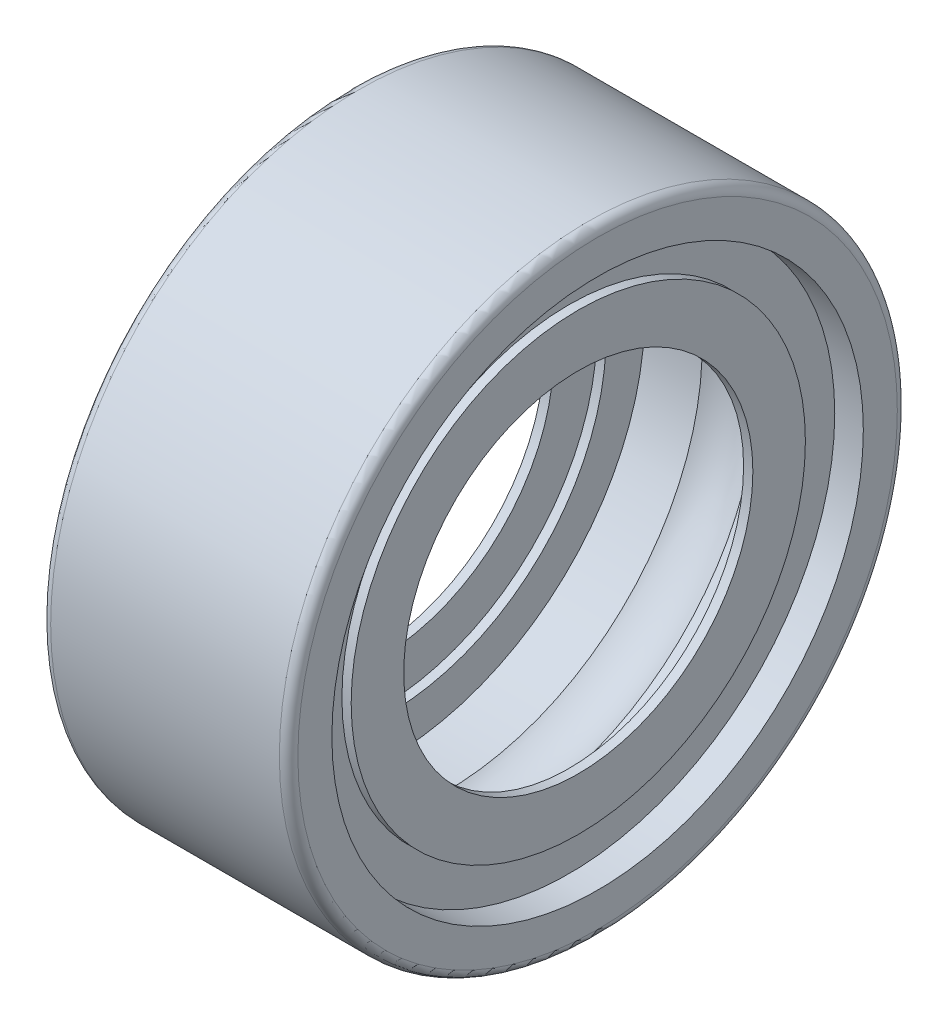
ISO-10303-21;
HEADER;
FILE_DESCRIPTION(('STEP AP214'),'2;1');
FILE_NAME('part.step','',(''),(''),'','','');
FILE_SCHEMA(('AUTOMOTIVE_DESIGN { 1 0 10303 214 1 1 1 1 }'));
ENDSEC;
DATA;
#1=APPLICATION_CONTEXT('core data for automotive mechanical design processes');
#2=APPLICATION_PROTOCOL_DEFINITION('international standard','automotive_design',2000,#1);
#3=PRODUCT_CONTEXT('',#1,'mechanical');
#4=PRODUCT('Part','Part','',(#3));
#5=PRODUCT_RELATED_PRODUCT_CATEGORY('part','',(#4));
#6=PRODUCT_DEFINITION_FORMATION('','',#4);
#7=PRODUCT_DEFINITION_CONTEXT('part definition',#1,'design');
#8=PRODUCT_DEFINITION('design','',#6,#7);
#9=PRODUCT_DEFINITION_SHAPE('','',#8);
#10=(LENGTH_UNIT() NAMED_UNIT(*) SI_UNIT(.MILLI.,.METRE.));
#11=(NAMED_UNIT(*) PLANE_ANGLE_UNIT() SI_UNIT($,.RADIAN.));
#12=(NAMED_UNIT(*) SI_UNIT($,.STERADIAN.) SOLID_ANGLE_UNIT());
#13=UNCERTAINTY_MEASURE_WITH_UNIT(LENGTH_MEASURE(1.E-05),#10,'distance_accuracy_value','');
#14=(GEOMETRIC_REPRESENTATION_CONTEXT(3) GLOBAL_UNCERTAINTY_ASSIGNED_CONTEXT((#13)) GLOBAL_UNIT_ASSIGNED_CONTEXT((#10,
#11,#12)) REPRESENTATION_CONTEXT('',''));
#15=CARTESIAN_POINT('',(0.,0.,0.));
#16=DIRECTION('',(0.,0.,1.));
#17=DIRECTION('',(1.,0.,0.));
#18=AXIS2_PLACEMENT_3D('',#15,#16,#17);
#19=CARTESIAN_POINT('',(0.899999999999999,0.,0.));
#20=DIRECTION('',(1.,0.,0.));
#21=DIRECTION('',(0.,0.,1.));
#22=AXIS2_PLACEMENT_3D('',#19,#20,#21);
#23=TOROIDAL_SURFACE('',#22,3.525,0.774999999999996);
#24=CARTESIAN_POINT('',(0.441742430504414,0.,0.));
#25=DIRECTION('',(-1.,0.,0.));
#26=DIRECTION('',(0.,0.,1.));
#27=AXIS2_PLACEMENT_3D('',#24,#25,#26);
#28=CIRCLE('',#27,4.15);
#29=CARTESIAN_POINT('',(0.441742430504414,0.,4.15));
#30=VERTEX_POINT('',#29);
#31=EDGE_CURVE('E445',#30,#30,#28,.T.);
#32=ORIENTED_EDGE('',*,*,#31,.T.);
#33=EDGE_LOOP('',(#32));
#34=FACE_BOUND('',#33,.T.);
#35=CARTESIAN_POINT('',(1.35825756949558,0.,0.));
#36=DIRECTION('',(-1.,0.,0.));
#37=DIRECTION('',(0.,0.,1.));
#38=AXIS2_PLACEMENT_3D('',#35,#36,#37);
#39=CIRCLE('',#38,4.15);
#40=CARTESIAN_POINT('',(1.35825756949558,0.,4.15));
#41=VERTEX_POINT('',#40);
#42=EDGE_CURVE('E448',#41,#41,#39,.F.);
#43=ORIENTED_EDGE('',*,*,#42,.T.);
#44=EDGE_LOOP('',(#43));
#45=FACE_BOUND('',#44,.T.);
#46=ADVANCED_FACE('F16',(#34,#45),#23,.F.);
#47=CARTESIAN_POINT('',(-0.0228787847477936,0.,0.));
#48=DIRECTION('',(-1.,0.,0.));
#49=DIRECTION('',(0.,0.,1.));
#50=AXIS2_PLACEMENT_3D('',#47,#48,#49);
#51=CYLINDRICAL_SURFACE('',#50,4.15);
#52=CARTESIAN_POINT('',(-0.487500000000001,0.,0.));
#53=DIRECTION('',(-1.,0.,0.));
#54=DIRECTION('',(0.,0.,1.));
#55=AXIS2_PLACEMENT_3D('',#52,#53,#54);
#56=CIRCLE('',#55,4.15);
#57=CARTESIAN_POINT('',(-0.487500000000001,0.,4.15));
#58=VERTEX_POINT('',#57);
#59=EDGE_CURVE('E449',#58,#58,#56,.F.);
#60=ORIENTED_EDGE('',*,*,#59,.F.);
#61=EDGE_LOOP('',(#60));
#62=FACE_BOUND('',#61,.T.);
#63=ORIENTED_EDGE('',*,*,#31,.F.);
#64=EDGE_LOOP('',(#63));
#65=FACE_BOUND('',#64,.T.);
#66=ADVANCED_FACE('F367',(#62,#65),#51,.F.);
#67=CARTESIAN_POINT('',(1.82287878474779,0.,0.));
#68=DIRECTION('',(-1.,0.,0.));
#69=DIRECTION('',(0.,0.,1.));
#70=AXIS2_PLACEMENT_3D('',#67,#68,#69);
#71=CYLINDRICAL_SURFACE('',#70,4.15);
#72=ORIENTED_EDGE('',*,*,#42,.F.);
#73=EDGE_LOOP('',(#72));
#74=FACE_BOUND('',#73,.T.);
#75=CARTESIAN_POINT('',(2.2875,0.,0.));
#76=DIRECTION('',(-1.,0.,0.));
#77=DIRECTION('',(0.,0.,1.));
#78=AXIS2_PLACEMENT_3D('',#75,#76,#77);
#79=CIRCLE('',#78,4.15);
#80=CARTESIAN_POINT('',(2.2875,0.,4.15));
#81=VERTEX_POINT('',#80);
#82=EDGE_CURVE('E452',#81,#81,#79,.T.);
#83=ORIENTED_EDGE('',*,*,#82,.F.);
#84=EDGE_LOOP('',(#83));
#85=FACE_BOUND('',#84,.T.);
#86=ADVANCED_FACE('F356',(#74,#85),#71,.F.);
#87=CARTESIAN_POINT('',(-0.487500000000001,0.,3.9125));
#88=DIRECTION('',(1.,0.,0.));
#89=DIRECTION('',(0.,0.,-1.));
#90=AXIS2_PLACEMENT_3D('',#87,#88,#89);
#91=PLANE('',#90);
#92=ORIENTED_EDGE('',*,*,#59,.T.);
#93=EDGE_LOOP('',(#92));
#94=FACE_BOUND('',#93,.T.);
#95=CARTESIAN_POINT('',(-0.487500000000001,0.,0.));
#96=DIRECTION('',(-1.,0.,0.));
#97=DIRECTION('',(0.,0.,1.));
#98=AXIS2_PLACEMENT_3D('',#95,#96,#97);
#99=CIRCLE('',#98,3.525);
#100=CARTESIAN_POINT('',(-0.487500000000001,0.,3.525));
#101=VERTEX_POINT('',#100);
#102=EDGE_CURVE('E499',#101,#101,#99,.T.);
#103=ORIENTED_EDGE('',*,*,#102,.T.);
#104=EDGE_LOOP('',(#103));
#105=FACE_BOUND('',#104,.T.);
#106=ADVANCED_FACE('F345',(#94,#105),#91,.T.);
#107=CARTESIAN_POINT('',(2.2875,0.,3.9125));
#108=DIRECTION('',(-1.,0.,0.));
#109=DIRECTION('',(0.,0.,1.));
#110=AXIS2_PLACEMENT_3D('',#107,#108,#109);
#111=PLANE('',#110);
#112=ORIENTED_EDGE('',*,*,#82,.T.);
#113=EDGE_LOOP('',(#112));
#114=FACE_BOUND('',#113,.T.);
#115=CARTESIAN_POINT('',(2.2875,0.,0.));
#116=DIRECTION('',(1.,0.,0.));
#117=DIRECTION('',(0.,0.,-1.));
#118=AXIS2_PLACEMENT_3D('',#115,#116,#117);
#119=CIRCLE('',#118,3.525);
#120=CARTESIAN_POINT('',(2.2875,0.,-3.525));
#121=VERTEX_POINT('',#120);
#122=EDGE_CURVE('E496',#121,#121,#119,.T.);
#123=ORIENTED_EDGE('',*,*,#122,.T.);
#124=EDGE_LOOP('',(#123));
#125=FACE_BOUND('',#124,.T.);
#126=ADVANCED_FACE('F334',(#114,#125),#111,.T.);
#127=CARTESIAN_POINT('',(-0.562500000000001,0.,0.));
#128=DIRECTION('',(-1.,0.,0.));
#129=DIRECTION('',(0.,0.,1.));
#130=AXIS2_PLACEMENT_3D('',#127,#128,#129);
#131=CYLINDRICAL_SURFACE('',#130,3.525);
#132=CARTESIAN_POINT('',(-0.637500000000001,0.,0.));
#133=DIRECTION('',(-1.,0.,0.));
#134=DIRECTION('',(0.,0.,1.));
#135=AXIS2_PLACEMENT_3D('',#132,#133,#134);
#136=CIRCLE('',#135,3.525);
#137=CARTESIAN_POINT('',(-0.637500000000001,0.,3.525));
#138=VERTEX_POINT('',#137);
#139=EDGE_CURVE('E493',#138,#138,#136,.F.);
#140=ORIENTED_EDGE('',*,*,#139,.F.);
#141=EDGE_LOOP('',(#140));
#142=FACE_BOUND('',#141,.T.);
#143=ORIENTED_EDGE('',*,*,#102,.F.);
#144=EDGE_LOOP('',(#143));
#145=FACE_BOUND('',#144,.T.);
#146=ADVANCED_FACE('F323',(#142,#145),#131,.F.);
#147=CARTESIAN_POINT('',(2.3625,0.,0.));
#148=DIRECTION('',(1.,0.,0.));
#149=DIRECTION('',(0.,0.,-1.));
#150=AXIS2_PLACEMENT_3D('',#147,#148,#149);
#151=CYLINDRICAL_SURFACE('',#150,3.525);
#152=CARTESIAN_POINT('',(2.4375,0.,0.));
#153=DIRECTION('',(1.,0.,0.));
#154=DIRECTION('',(0.,0.,-1.));
#155=AXIS2_PLACEMENT_3D('',#152,#153,#154);
#156=CIRCLE('',#155,3.525);
#157=CARTESIAN_POINT('',(2.4375,0.,-3.525));
#158=VERTEX_POINT('',#157);
#159=EDGE_CURVE('E490',#158,#158,#156,.F.);
#160=ORIENTED_EDGE('',*,*,#159,.F.);
#161=EDGE_LOOP('',(#160));
#162=FACE_BOUND('',#161,.T.);
#163=ORIENTED_EDGE('',*,*,#122,.F.);
#164=EDGE_LOOP('',(#163));
#165=FACE_BOUND('',#164,.T.);
#166=ADVANCED_FACE('F312',(#162,#165),#151,.F.);
#167=CARTESIAN_POINT('',(-0.637500000000001,0.,3.175));
#168=DIRECTION('',(1.,0.,0.));
#169=DIRECTION('',(0.,0.,-1.));
#170=AXIS2_PLACEMENT_3D('',#167,#168,#169);
#171=PLANE('',#170);
#172=ORIENTED_EDGE('',*,*,#139,.T.);
#173=EDGE_LOOP('',(#172));
#174=FACE_BOUND('',#173,.T.);
#175=CARTESIAN_POINT('',(-0.637500000000001,0.,0.));
#176=DIRECTION('',(-1.,0.,0.));
#177=DIRECTION('',(0.,0.,1.));
#178=AXIS2_PLACEMENT_3D('',#175,#176,#177);
#179=CIRCLE('',#178,2.825);
#180=CARTESIAN_POINT('',(-0.637500000000001,0.,2.825));
#181=VERTEX_POINT('',#180);
#182=EDGE_CURVE('E487',#181,#181,#179,.T.);
#183=ORIENTED_EDGE('',*,*,#182,.T.);
#184=EDGE_LOOP('',(#183));
#185=FACE_BOUND('',#184,.T.);
#186=ADVANCED_FACE('F301',(#174,#185),#171,.T.);
#187=CARTESIAN_POINT('',(2.4375,0.,3.175));
#188=DIRECTION('',(-1.,0.,0.));
#189=DIRECTION('',(0.,0.,1.));
#190=AXIS2_PLACEMENT_3D('',#187,#188,#189);
#191=PLANE('',#190);
#192=ORIENTED_EDGE('',*,*,#159,.T.);
#193=EDGE_LOOP('',(#192));
#194=FACE_BOUND('',#193,.T.);
#195=CARTESIAN_POINT('',(2.4375,0.,0.));
#196=DIRECTION('',(1.,0.,0.));
#197=DIRECTION('',(0.,0.,-1.));
#198=AXIS2_PLACEMENT_3D('',#195,#196,#197);
#199=CIRCLE('',#198,2.825);
#200=CARTESIAN_POINT('',(2.4375,0.,-2.825));
#201=VERTEX_POINT('',#200);
#202=EDGE_CURVE('E484',#201,#201,#199,.T.);
#203=ORIENTED_EDGE('',*,*,#202,.T.);
#204=EDGE_LOOP('',(#203));
#205=FACE_BOUND('',#204,.T.);
#206=ADVANCED_FACE('F290',(#194,#205),#191,.T.);
#207=CARTESIAN_POINT('',(-0.712500000000001,0.,0.));
#208=DIRECTION('',(-1.,0.,0.));
#209=DIRECTION('',(0.,0.,1.));
#210=AXIS2_PLACEMENT_3D('',#207,#208,#209);
#211=CYLINDRICAL_SURFACE('',#210,2.825);
#212=CARTESIAN_POINT('',(-0.787500000000001,0.,0.));
#213=DIRECTION('',(-1.,0.,0.));
#214=DIRECTION('',(0.,0.,1.));
#215=AXIS2_PLACEMENT_3D('',#212,#213,#214);
#216=CIRCLE('',#215,2.825);
#217=CARTESIAN_POINT('',(-0.787500000000001,0.,2.825));
#218=VERTEX_POINT('',#217);
#219=EDGE_CURVE('E481',#218,#218,#216,.F.);
#220=ORIENTED_EDGE('',*,*,#219,.F.);
#221=EDGE_LOOP('',(#220));
#222=FACE_BOUND('',#221,.T.);
#223=ORIENTED_EDGE('',*,*,#182,.F.);
#224=EDGE_LOOP('',(#223));
#225=FACE_BOUND('',#224,.T.);
#226=ADVANCED_FACE('F279',(#222,#225),#211,.F.);
#227=CARTESIAN_POINT('',(2.5125,0.,0.));
#228=DIRECTION('',(1.,0.,0.));
#229=DIRECTION('',(0.,0.,-1.));
#230=AXIS2_PLACEMENT_3D('',#227,#228,#229);
#231=CYLINDRICAL_SURFACE('',#230,2.825);
#232=CARTESIAN_POINT('',(2.5875,0.,0.));
#233=DIRECTION('',(1.,0.,0.));
#234=DIRECTION('',(0.,0.,-1.));
#235=AXIS2_PLACEMENT_3D('',#232,#233,#234);
#236=CIRCLE('',#235,2.825);
#237=CARTESIAN_POINT('',(2.5875,0.,-2.825));
#238=VERTEX_POINT('',#237);
#239=EDGE_CURVE('E478',#238,#238,#236,.F.);
#240=ORIENTED_EDGE('',*,*,#239,.F.);
#241=EDGE_LOOP('',(#240));
#242=FACE_BOUND('',#241,.T.);
#243=ORIENTED_EDGE('',*,*,#202,.F.);
#244=EDGE_LOOP('',(#243));
#245=FACE_BOUND('',#244,.T.);
#246=ADVANCED_FACE('F268',(#242,#245),#231,.F.);
#247=CARTESIAN_POINT('',(-0.787500000000001,0.,3.25));
#248=DIRECTION('',(-1.,0.,0.));
#249=DIRECTION('',(0.,0.,1.));
#250=AXIS2_PLACEMENT_3D('',#247,#248,#249);
#251=PLANE('',#250);
#252=ORIENTED_EDGE('',*,*,#219,.T.);
#253=EDGE_LOOP('',(#252));
#254=FACE_BOUND('',#253,.T.);
#255=CARTESIAN_POINT('',(-0.787500000000001,0.,0.));
#256=DIRECTION('',(-1.,0.,0.));
#257=DIRECTION('',(0.,0.,1.));
#258=AXIS2_PLACEMENT_3D('',#255,#256,#257);
#259=CIRCLE('',#258,3.675);
#260=CARTESIAN_POINT('',(-0.787500000000001,0.,3.675));
#261=VERTEX_POINT('',#260);
#262=EDGE_CURVE('E475',#261,#261,#259,.F.);
#263=ORIENTED_EDGE('',*,*,#262,.F.);
#264=EDGE_LOOP('',(#263));
#265=FACE_BOUND('',#264,.T.);
#266=ADVANCED_FACE('F257',(#254,#265),#251,.T.);
#267=CARTESIAN_POINT('',(2.5875,0.,3.25));
#268=DIRECTION('',(1.,0.,0.));
#269=DIRECTION('',(0.,0.,-1.));
#270=AXIS2_PLACEMENT_3D('',#267,#268,#269);
#271=PLANE('',#270);
#272=ORIENTED_EDGE('',*,*,#239,.T.);
#273=EDGE_LOOP('',(#272));
#274=FACE_BOUND('',#273,.T.);
#275=CARTESIAN_POINT('',(2.5875,0.,0.));
#276=DIRECTION('',(1.,0.,0.));
#277=DIRECTION('',(0.,0.,-1.));
#278=AXIS2_PLACEMENT_3D('',#275,#276,#277);
#279=CIRCLE('',#278,3.675);
#280=CARTESIAN_POINT('',(2.5875,0.,-3.675));
#281=VERTEX_POINT('',#280);
#282=EDGE_CURVE('E472',#281,#281,#279,.F.);
#283=ORIENTED_EDGE('',*,*,#282,.F.);
#284=EDGE_LOOP('',(#283));
#285=FACE_BOUND('',#284,.T.);
#286=ADVANCED_FACE('F246',(#274,#285),#271,.T.);
#287=CARTESIAN_POINT('',(-0.712500000000001,0.,0.));
#288=DIRECTION('',(-1.,0.,0.));
#289=DIRECTION('',(0.,0.,1.));
#290=AXIS2_PLACEMENT_3D('',#287,#288,#289);
#291=CYLINDRICAL_SURFACE('',#290,3.675);
#292=CARTESIAN_POINT('',(-0.637500000000001,0.,0.));
#293=DIRECTION('',(-1.,0.,0.));
#294=DIRECTION('',(0.,0.,1.));
#295=AXIS2_PLACEMENT_3D('',#292,#293,#294);
#296=CIRCLE('',#295,3.675);
#297=CARTESIAN_POINT('',(-0.637500000000001,0.,3.675));
#298=VERTEX_POINT('',#297);
#299=EDGE_CURVE('E469',#298,#298,#296,.F.);
#300=ORIENTED_EDGE('',*,*,#299,.F.);
#301=EDGE_LOOP('',(#300));
#302=FACE_BOUND('',#301,.T.);
#303=ORIENTED_EDGE('',*,*,#262,.T.);
#304=EDGE_LOOP('',(#303));
#305=FACE_BOUND('',#304,.T.);
#306=ADVANCED_FACE('F235',(#302,#305),#291,.T.);
#307=CARTESIAN_POINT('',(2.5125,0.,0.));
#308=DIRECTION('',(1.,0.,0.));
#309=DIRECTION('',(0.,0.,-1.));
#310=AXIS2_PLACEMENT_3D('',#307,#308,#309);
#311=CYLINDRICAL_SURFACE('',#310,3.675);
#312=CARTESIAN_POINT('',(2.4375,0.,0.));
#313=DIRECTION('',(1.,0.,0.));
#314=DIRECTION('',(0.,0.,-1.));
#315=AXIS2_PLACEMENT_3D('',#312,#313,#314);
#316=CIRCLE('',#315,3.675);
#317=CARTESIAN_POINT('',(2.4375,0.,-3.675));
#318=VERTEX_POINT('',#317);
#319=EDGE_CURVE('E466',#318,#318,#316,.F.);
#320=ORIENTED_EDGE('',*,*,#319,.F.);
#321=EDGE_LOOP('',(#320));
#322=FACE_BOUND('',#321,.T.);
#323=ORIENTED_EDGE('',*,*,#282,.T.);
#324=EDGE_LOOP('',(#323));
#325=FACE_BOUND('',#324,.T.);
#326=ADVANCED_FACE('F224',(#322,#325),#311,.T.);
#327=CARTESIAN_POINT('',(-0.637500000000001,0.,3.9875));
#328=DIRECTION('',(-1.,0.,0.));
#329=DIRECTION('',(0.,0.,1.));
#330=AXIS2_PLACEMENT_3D('',#327,#328,#329);
#331=PLANE('',#330);
#332=ORIENTED_EDGE('',*,*,#299,.T.);
#333=EDGE_LOOP('',(#332));
#334=FACE_BOUND('',#333,.T.);
#335=CARTESIAN_POINT('',(-0.637500000000001,0.,0.));
#336=DIRECTION('',(-1.,0.,0.));
#337=DIRECTION('',(0.,0.,1.));
#338=AXIS2_PLACEMENT_3D('',#335,#336,#337);
#339=CIRCLE('',#338,4.3);
#340=CARTESIAN_POINT('',(-0.637500000000001,0.,4.3));
#341=VERTEX_POINT('',#340);
#342=EDGE_CURVE('E463',#341,#341,#339,.T.);
#343=ORIENTED_EDGE('',*,*,#342,.T.);
#344=EDGE_LOOP('',(#343));
#345=FACE_BOUND('',#344,.T.);
#346=ADVANCED_FACE('F213',(#334,#345),#331,.T.);
#347=CARTESIAN_POINT('',(2.4375,0.,3.9875));
#348=DIRECTION('',(1.,0.,0.));
#349=DIRECTION('',(0.,0.,-1.));
#350=AXIS2_PLACEMENT_3D('',#347,#348,#349);
#351=PLANE('',#350);
#352=ORIENTED_EDGE('',*,*,#319,.T.);
#353=EDGE_LOOP('',(#352));
#354=FACE_BOUND('',#353,.T.);
#355=CARTESIAN_POINT('',(2.4375,0.,0.));
#356=DIRECTION('',(-1.,0.,0.));
#357=DIRECTION('',(0.,0.,1.));
#358=AXIS2_PLACEMENT_3D('',#355,#356,#357);
#359=CIRCLE('',#358,4.3);
#360=CARTESIAN_POINT('',(2.4375,0.,4.3));
#361=VERTEX_POINT('',#360);
#362=EDGE_CURVE('E460',#361,#361,#359,.F.);
#363=ORIENTED_EDGE('',*,*,#362,.T.);
#364=EDGE_LOOP('',(#363));
#365=FACE_BOUND('',#364,.T.);
#366=ADVANCED_FACE('F203',(#354,#365),#351,.T.);
#367=CARTESIAN_POINT('',(-0.793750000000001,0.,0.));
#368=DIRECTION('',(-1.,0.,0.));
#369=DIRECTION('',(0.,0.,1.));
#370=AXIS2_PLACEMENT_3D('',#367,#368,#369);
#371=CYLINDRICAL_SURFACE('',#370,4.3);
#372=CARTESIAN_POINT('',(-1.1,0.,0.));
#373=DIRECTION('',(-1.,0.,0.));
#374=DIRECTION('',(0.,0.,1.));
#375=AXIS2_PLACEMENT_3D('',#372,#373,#374);
#376=CIRCLE('',#375,4.3);
#377=CARTESIAN_POINT('',(-1.1,0.,4.3));
#378=VERTEX_POINT('',#377);
#379=EDGE_CURVE('E54',#378,#378,#376,.F.);
#380=ORIENTED_EDGE('',*,*,#379,.F.);
#381=EDGE_LOOP('',(#380));
#382=FACE_BOUND('',#381,.T.);
#383=ORIENTED_EDGE('',*,*,#342,.F.);
#384=EDGE_LOOP('',(#383));
#385=FACE_BOUND('',#384,.T.);
#386=ADVANCED_FACE('F193',(#382,#385),#371,.F.);
#387=CARTESIAN_POINT('',(2.59375,0.,0.));
#388=DIRECTION('',(-1.,0.,0.));
#389=DIRECTION('',(0.,0.,1.));
#390=AXIS2_PLACEMENT_3D('',#387,#388,#389);
#391=CYLINDRICAL_SURFACE('',#390,4.3);
#392=ORIENTED_EDGE('',*,*,#362,.F.);
#393=EDGE_LOOP('',(#392));
#394=FACE_BOUND('',#393,.T.);
#395=CARTESIAN_POINT('',(2.9,0.,0.));
#396=DIRECTION('',(-1.,0.,0.));
#397=DIRECTION('',(0.,0.,1.));
#398=AXIS2_PLACEMENT_3D('',#395,#396,#397);
#399=CIRCLE('',#398,4.3);
#400=CARTESIAN_POINT('',(2.9,0.,4.3));
#401=VERTEX_POINT('',#400);
#402=EDGE_CURVE('E53',#401,#401,#399,.T.);
#403=ORIENTED_EDGE('',*,*,#402,.F.);
#404=EDGE_LOOP('',(#403));
#405=FACE_BOUND('',#404,.T.);
#406=ADVANCED_FACE('F79',(#394,#405),#391,.F.);
#407=CARTESIAN_POINT('',(-1.1,0.,-4.575));
#408=DIRECTION('',(-1.,0.,0.));
#409=DIRECTION('',(0.,0.,1.));
#410=AXIS2_PLACEMENT_3D('',#407,#408,#409);
#411=PLANE('',#410);
#412=ORIENTED_EDGE('',*,*,#379,.T.);
#413=EDGE_LOOP('',(#412));
#414=FACE_BOUND('',#413,.T.);
#415=CARTESIAN_POINT('',(-1.1,0.,0.));
#416=DIRECTION('',(1.,0.,0.));
#417=DIRECTION('',(0.,0.,-1.));
#418=AXIS2_PLACEMENT_3D('',#415,#416,#417);
#419=CIRCLE('',#418,4.85);
#420=CARTESIAN_POINT('',(-1.1,0.,-4.85));
#421=VERTEX_POINT('',#420);
#422=CARTESIAN_POINT('',(-1.09999999999999,0.,4.85));
#423=VERTEX_POINT('',#422);
#424=EDGE_CURVE('E49',#421,#423,#419,.T.);
#425=ORIENTED_EDGE('',*,*,#424,.F.);
#426=CARTESIAN_POINT('',(-1.1,0.,0.));
#427=DIRECTION('',(1.,0.,0.));
#428=DIRECTION('',(0.,0.,1.));
#429=AXIS2_PLACEMENT_3D('',#426,#427,#428);
#430=CIRCLE('',#429,4.85);
#431=EDGE_CURVE('E45',#423,#421,#430,.T.);
#432=ORIENTED_EDGE('',*,*,#431,.F.);
#433=EDGE_LOOP('',(#425,#432));
#434=FACE_BOUND('',#433,.T.);
#435=ADVANCED_FACE('F58',(#414,#434),#411,.T.);
#436=CARTESIAN_POINT('',(2.9,0.,-4.575));
#437=DIRECTION('',(1.,0.,0.));
#438=DIRECTION('',(0.,0.,-1.));
#439=AXIS2_PLACEMENT_3D('',#436,#437,#438);
#440=PLANE('',#439);
#441=CARTESIAN_POINT('',(2.9,0.,0.));
#442=DIRECTION('',(-1.,0.,0.));
#443=DIRECTION('',(0.,0.,1.));
#444=AXIS2_PLACEMENT_3D('',#441,#442,#443);
#445=CIRCLE('',#444,4.85);
#446=CARTESIAN_POINT('',(2.9,0.,4.85));
#447=VERTEX_POINT('',#446);
#448=CARTESIAN_POINT('',(2.9,0.,-4.85));
#449=VERTEX_POINT('',#448);
#450=EDGE_CURVE('E59',#447,#449,#445,.T.);
#451=ORIENTED_EDGE('',*,*,#450,.F.);
#452=CARTESIAN_POINT('',(2.9,0.,0.));
#453=DIRECTION('',(-1.,0.,0.));
#454=DIRECTION('',(0.,0.,-1.));
#455=AXIS2_PLACEMENT_3D('',#452,#453,#454);
#456=CIRCLE('',#455,4.85);
#457=EDGE_CURVE('E34',#447,#449,#456,.F.);
#458=ORIENTED_EDGE('',*,*,#457,.T.);
#459=EDGE_LOOP('',(#451,#458));
#460=FACE_BOUND('',#459,.T.);
#461=ORIENTED_EDGE('',*,*,#402,.T.);
#462=EDGE_LOOP('',(#461));
#463=FACE_BOUND('',#462,.T.);
#464=ADVANCED_FACE('F78',(#460,#463),#440,.T.);
#465=CARTESIAN_POINT('',(-0.950000000000002,0.,0.));
#466=DIRECTION('',(1.,0.,0.));
#467=DIRECTION('',(0.,0.,1.));
#468=AXIS2_PLACEMENT_3D('',#465,#466,#467);
#469=TOROIDAL_SURFACE('',#468,4.85,0.150000000000001);
#470=CARTESIAN_POINT('',(-0.950000000000002,0.,0.));
#471=DIRECTION('',(-1.,0.,0.));
#472=DIRECTION('',(0.,0.,1.));
#473=AXIS2_PLACEMENT_3D('',#470,#471,#472);
#474=CIRCLE('',#473,5.);
#475=CARTESIAN_POINT('',(-0.950000000000002,0.,5.));
#476=VERTEX_POINT('',#475);
#477=EDGE_CURVE('E28',#476,#476,#474,.F.);
#478=ORIENTED_EDGE('',*,*,#477,.F.);
#479=EDGE_LOOP('',(#478));
#480=FACE_BOUND('',#479,.T.);
#481=ORIENTED_EDGE('',*,*,#424,.T.);
#482=ORIENTED_EDGE('',*,*,#431,.T.);
#483=EDGE_LOOP('',(#481,#482));
#484=FACE_BOUND('',#483,.T.);
#485=ADVANCED_FACE('F48',(#480,#484),#469,.T.);
#486=CARTESIAN_POINT('',(2.75,0.,0.));
#487=DIRECTION('',(1.,0.,0.));
#488=DIRECTION('',(0.,0.,1.));
#489=AXIS2_PLACEMENT_3D('',#486,#487,#488);
#490=TOROIDAL_SURFACE('',#489,4.85,0.150000000000001);
#491=CARTESIAN_POINT('',(2.75,0.,0.));
#492=DIRECTION('',(-1.,0.,0.));
#493=DIRECTION('',(0.,0.,1.));
#494=AXIS2_PLACEMENT_3D('',#491,#492,#493);
#495=CIRCLE('',#494,5.);
#496=CARTESIAN_POINT('',(2.75,0.,5.));
#497=VERTEX_POINT('',#496);
#498=EDGE_CURVE('E11',#497,#497,#495,.T.);
#499=ORIENTED_EDGE('',*,*,#498,.F.);
#500=EDGE_LOOP('',(#499));
#501=FACE_BOUND('',#500,.T.);
#502=ORIENTED_EDGE('',*,*,#450,.T.);
#503=ORIENTED_EDGE('',*,*,#457,.F.);
#504=EDGE_LOOP('',(#502,#503));
#505=FACE_BOUND('',#504,.T.);
#506=ADVANCED_FACE('F104',(#501,#505),#490,.T.);
#507=CARTESIAN_POINT('',(0.899999999999998,0.,0.));
#508=DIRECTION('',(-1.,0.,0.));
#509=DIRECTION('',(0.,0.,1.));
#510=AXIS2_PLACEMENT_3D('',#507,#508,#509);
#511=CYLINDRICAL_SURFACE('',#510,5.);
#512=ORIENTED_EDGE('',*,*,#477,.T.);
#513=EDGE_LOOP('',(#512));
#514=FACE_BOUND('',#513,.T.);
#515=ORIENTED_EDGE('',*,*,#498,.T.);
#516=EDGE_LOOP('',(#515));
#517=FACE_BOUND('',#516,.T.);
#518=ADVANCED_FACE('F133',(#514,#517),#511,.T.);
#519=CLOSED_SHELL('',(#46,#66,#86,#106,#126,#146,#166,#186,#206,#226,#246,#266,#286,#306,#326,
#346,#366,#386,#406,#435,#464,#485,#506,#518));
#520=MANIFOLD_SOLID_BREP('B1',#519);
#521=ADVANCED_BREP_SHAPE_REPRESENTATION('',(#18,#520),#14);
#522=SHAPE_DEFINITION_REPRESENTATION(#9,#521);
ENDSEC;
END-ISO-10303-21;
